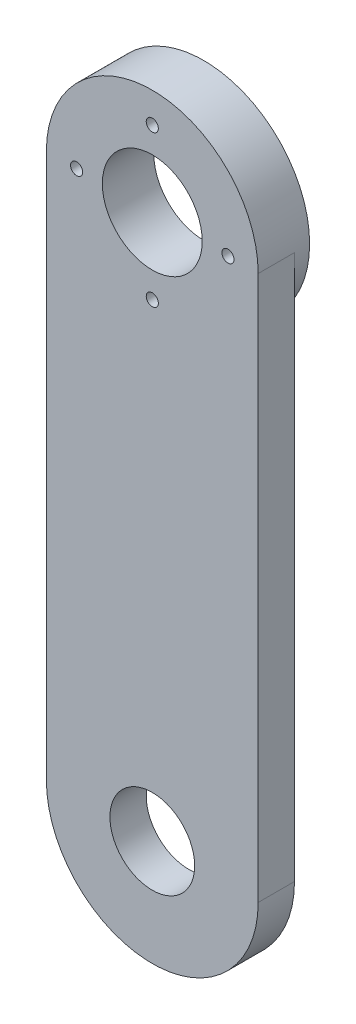
ISO-10303-21;
HEADER;
FILE_DESCRIPTION(('STEP AP214'),'2;1');
FILE_NAME('part.step','',(''),(''),'','','');
FILE_SCHEMA(('AUTOMOTIVE_DESIGN { 1 0 10303 214 1 1 1 1 }'));
ENDSEC;
DATA;
#1=APPLICATION_CONTEXT('core data for automotive mechanical design processes');
#2=APPLICATION_PROTOCOL_DEFINITION('international standard','automotive_design',2000,#1);
#3=PRODUCT_CONTEXT('',#1,'mechanical');
#4=PRODUCT('Part','Part','',(#3));
#5=PRODUCT_RELATED_PRODUCT_CATEGORY('part','',(#4));
#6=PRODUCT_DEFINITION_FORMATION('','',#4);
#7=PRODUCT_DEFINITION_CONTEXT('part definition',#1,'design');
#8=PRODUCT_DEFINITION('design','',#6,#7);
#9=PRODUCT_DEFINITION_SHAPE('','',#8);
#10=(LENGTH_UNIT() NAMED_UNIT(*) SI_UNIT(.MILLI.,.METRE.));
#11=(NAMED_UNIT(*) PLANE_ANGLE_UNIT() SI_UNIT($,.RADIAN.));
#12=(NAMED_UNIT(*) SI_UNIT($,.STERADIAN.) SOLID_ANGLE_UNIT());
#13=UNCERTAINTY_MEASURE_WITH_UNIT(LENGTH_MEASURE(1.E-05),#10,'distance_accuracy_value','');
#14=(GEOMETRIC_REPRESENTATION_CONTEXT(3) GLOBAL_UNCERTAINTY_ASSIGNED_CONTEXT((#13)) GLOBAL_UNIT_ASSIGNED_CONTEXT((#10,
#11,#12)) REPRESENTATION_CONTEXT('',''));
#15=CARTESIAN_POINT('',(0.,0.,0.));
#16=DIRECTION('',(0.,0.,1.));
#17=DIRECTION('',(1.,0.,0.));
#18=AXIS2_PLACEMENT_3D('',#15,#16,#17);
#19=CARTESIAN_POINT('',(0.,53.1386861313869,12.));
#20=DIRECTION('',(0.,0.,1.));
#21=DIRECTION('',(1.,0.,0.));
#22=AXIS2_PLACEMENT_3D('',#19,#20,#21);
#23=PLANE('',#22);
#24=CARTESIAN_POINT('',(0.,28.1386861313869,12.));
#25=DIRECTION('',(0.,0.,1.));
#26=DIRECTION('',(1.,0.,0.));
#27=AXIS2_PLACEMENT_3D('',#24,#25,#26);
#28=CIRCLE('',#27,2.);
#29=CARTESIAN_POINT('',(1.99999999999997,28.1386861313869,12.));
#30=VERTEX_POINT('',#29);
#31=EDGE_CURVE('E148',#30,#30,#28,.T.);
#32=ORIENTED_EDGE('',*,*,#31,.F.);
#33=EDGE_LOOP('',(#32));
#34=FACE_BOUND('',#33,.T.);
#35=CARTESIAN_POINT('',(0.,78.1386861313869,12.));
#36=DIRECTION('',(0.,0.,1.));
#37=DIRECTION('',(1.,0.,0.));
#38=AXIS2_PLACEMENT_3D('',#35,#36,#37);
#39=CIRCLE('',#38,2.);
#40=CARTESIAN_POINT('',(1.99999999999997,78.1386861313869,12.));
#41=VERTEX_POINT('',#40);
#42=EDGE_CURVE('E137',#41,#41,#39,.T.);
#43=ORIENTED_EDGE('',*,*,#42,.F.);
#44=EDGE_LOOP('',(#43));
#45=FACE_BOUND('',#44,.T.);
#46=CARTESIAN_POINT('',(0.,53.1386861313869,12.));
#47=DIRECTION('',(0.,0.,1.));
#48=DIRECTION('',(1.,0.,0.));
#49=AXIS2_PLACEMENT_3D('',#46,#47,#48);
#50=CIRCLE('',#49,16.5);
#51=CARTESIAN_POINT('',(16.5,53.1386861313869,12.));
#52=VERTEX_POINT('',#51);
#53=EDGE_CURVE('E99',#52,#52,#50,.T.);
#54=ORIENTED_EDGE('',*,*,#53,.F.);
#55=EDGE_LOOP('',(#54));
#56=FACE_BOUND('',#55,.T.);
#57=CARTESIAN_POINT('',(0.,53.1386861313869,12.));
#58=DIRECTION('',(0.,0.,1.));
#59=DIRECTION('',(1.,0.,0.));
#60=AXIS2_PLACEMENT_3D('',#57,#58,#59);
#61=CIRCLE('',#60,35.);
#62=CARTESIAN_POINT('',(35.,53.1386861313869,12.));
#63=VERTEX_POINT('',#62);
#64=CARTESIAN_POINT('',(-35.,53.1386861313869,12.));
#65=VERTEX_POINT('',#64);
#66=EDGE_CURVE('E104',#63,#65,#61,.T.);
#67=ORIENTED_EDGE('',*,*,#66,.T.);
#68=DIRECTION('',(0.,-1.,0.));
#69=VECTOR('',#68,1.);
#70=CARTESIAN_POINT('',(-35.,53.1386861313869,12.));
#71=LINE('',#70,#69);
#72=CARTESIAN_POINT('',(-35.,-126.861313868613,12.));
#73=VERTEX_POINT('',#72);
#74=EDGE_CURVE('E87',#65,#73,#71,.T.);
#75=ORIENTED_EDGE('',*,*,#74,.T.);
#76=CARTESIAN_POINT('',(0.,-126.861313868613,12.));
#77=DIRECTION('',(0.,0.,1.));
#78=DIRECTION('',(1.,0.,0.));
#79=AXIS2_PLACEMENT_3D('',#76,#77,#78);
#80=CIRCLE('',#79,35.);
#81=CARTESIAN_POINT('',(35.,-126.861313868613,12.));
#82=VERTEX_POINT('',#81);
#83=EDGE_CURVE('E112',#73,#82,#80,.T.);
#84=ORIENTED_EDGE('',*,*,#83,.T.);
#85=DIRECTION('',(0.,1.,0.));
#86=VECTOR('',#85,1.);
#87=CARTESIAN_POINT('',(35.,53.1386861313869,12.));
#88=LINE('',#87,#86);
#89=EDGE_CURVE('E58',#82,#63,#88,.T.);
#90=ORIENTED_EDGE('',*,*,#89,.T.);
#91=EDGE_LOOP('',(#67,#75,#84,#90));
#92=FACE_BOUND('',#91,.T.);
#93=CARTESIAN_POINT('',(0.,-126.861313868613,12.));
#94=DIRECTION('',(0.,0.,1.));
#95=DIRECTION('',(1.,0.,0.));
#96=AXIS2_PLACEMENT_3D('',#93,#94,#95);
#97=CIRCLE('',#96,14.);
#98=CARTESIAN_POINT('',(14.,-126.861313868613,12.));
#99=VERTEX_POINT('',#98);
#100=EDGE_CURVE('E132',#99,#99,#97,.T.);
#101=ORIENTED_EDGE('',*,*,#100,.F.);
#102=EDGE_LOOP('',(#101));
#103=FACE_BOUND('',#102,.T.);
#104=CARTESIAN_POINT('',(-25.,53.1386861313869,12.));
#105=DIRECTION('',(0.,0.,1.));
#106=DIRECTION('',(1.,0.,0.));
#107=AXIS2_PLACEMENT_3D('',#104,#105,#106);
#108=CIRCLE('',#107,2.);
#109=CARTESIAN_POINT('',(-23.,53.1386861313869,12.));
#110=VERTEX_POINT('',#109);
#111=EDGE_CURVE('E144',#110,#110,#108,.T.);
#112=ORIENTED_EDGE('',*,*,#111,.F.);
#113=EDGE_LOOP('',(#112));
#114=FACE_BOUND('',#113,.T.);
#115=CARTESIAN_POINT('',(25.,53.1386861313869,12.));
#116=DIRECTION('',(0.,0.,1.));
#117=DIRECTION('',(1.,0.,0.));
#118=AXIS2_PLACEMENT_3D('',#115,#116,#117);
#119=CIRCLE('',#118,2.);
#120=CARTESIAN_POINT('',(27.,53.1386861313869,12.));
#121=VERTEX_POINT('',#120);
#122=EDGE_CURVE('E152',#121,#121,#119,.T.);
#123=ORIENTED_EDGE('',*,*,#122,.F.);
#124=EDGE_LOOP('',(#123));
#125=FACE_BOUND('',#124,.T.);
#126=ADVANCED_FACE('F39',(#34,#45,#56,#92,#103,#114,#125),#23,.T.);
#127=CARTESIAN_POINT('',(0.,53.1386861313869,0.));
#128=DIRECTION('',(0.,0.,1.));
#129=DIRECTION('',(1.,0.,0.));
#130=AXIS2_PLACEMENT_3D('',#127,#128,#129);
#131=PLANE('',#130);
#132=CARTESIAN_POINT('',(0.,53.1386861313869,0.));
#133=DIRECTION('',(0.,0.,-1.));
#134=DIRECTION('',(-1.,0.,0.));
#135=AXIS2_PLACEMENT_3D('',#132,#133,#134);
#136=CIRCLE('',#135,35.);
#137=CARTESIAN_POINT('',(35.,53.1386861313869,0.));
#138=VERTEX_POINT('',#137);
#139=CARTESIAN_POINT('',(-35.,53.1386861313869,0.));
#140=VERTEX_POINT('',#139);
#141=EDGE_CURVE('E11',#138,#140,#136,.T.);
#142=ORIENTED_EDGE('',*,*,#141,.F.);
#143=DIRECTION('',(0.,1.,0.));
#144=VECTOR('',#143,1.);
#145=CARTESIAN_POINT('',(35.,53.1386861313869,0.));
#146=LINE('',#145,#144);
#147=CARTESIAN_POINT('',(35.,-126.861313868613,0.));
#148=VERTEX_POINT('',#147);
#149=EDGE_CURVE('E115',#148,#138,#146,.T.);
#150=ORIENTED_EDGE('',*,*,#149,.F.);
#151=CARTESIAN_POINT('',(0.,-126.861313868613,0.));
#152=DIRECTION('',(0.,0.,1.));
#153=DIRECTION('',(1.,0.,0.));
#154=AXIS2_PLACEMENT_3D('',#151,#152,#153);
#155=CIRCLE('',#154,35.);
#156=CARTESIAN_POINT('',(-35.,-126.861313868613,0.));
#157=VERTEX_POINT('',#156);
#158=EDGE_CURVE('E73',#157,#148,#155,.T.);
#159=ORIENTED_EDGE('',*,*,#158,.F.);
#160=DIRECTION('',(0.,-1.,0.));
#161=VECTOR('',#160,1.);
#162=CARTESIAN_POINT('',(-35.,53.1386861313869,0.));
#163=LINE('',#162,#161);
#164=EDGE_CURVE('E91',#140,#157,#163,.T.);
#165=ORIENTED_EDGE('',*,*,#164,.F.);
#166=EDGE_LOOP('',(#142,#150,#159,#165));
#167=FACE_BOUND('',#166,.T.);
#168=CARTESIAN_POINT('',(0.,-126.861313868613,0.));
#169=DIRECTION('',(0.,0.,1.));
#170=DIRECTION('',(1.,0.,0.));
#171=AXIS2_PLACEMENT_3D('',#168,#169,#170);
#172=CIRCLE('',#171,14.);
#173=CARTESIAN_POINT('',(14.,-126.861313868613,0.));
#174=VERTEX_POINT('',#173);
#175=EDGE_CURVE('E133',#174,#174,#172,.T.);
#176=ORIENTED_EDGE('',*,*,#175,.T.);
#177=EDGE_LOOP('',(#176));
#178=FACE_BOUND('',#177,.T.);
#179=ADVANCED_FACE('F96',(#167,#178),#131,.F.);
#180=CARTESIAN_POINT('',(0.,53.1386861313869,12.));
#181=DIRECTION('',(0.,0.,-1.));
#182=DIRECTION('',(-1.,0.,0.));
#183=AXIS2_PLACEMENT_3D('',#180,#181,#182);
#184=CYLINDRICAL_SURFACE('',#183,35.);
#185=DIRECTION('',(0.,0.,-1.));
#186=VECTOR('',#185,1.);
#187=CARTESIAN_POINT('',(35.,53.1386861313869,12.));
#188=LINE('',#187,#186);
#189=EDGE_CURVE('E103',#63,#138,#188,.T.);
#190=ORIENTED_EDGE('',*,*,#189,.T.);
#191=ORIENTED_EDGE('',*,*,#141,.T.);
#192=DIRECTION('',(0.,0.,-1.));
#193=VECTOR('',#192,1.);
#194=CARTESIAN_POINT('',(-35.,53.1386861313869,12.));
#195=LINE('',#194,#193);
#196=EDGE_CURVE('E43',#65,#140,#195,.T.);
#197=ORIENTED_EDGE('',*,*,#196,.F.);
#198=ORIENTED_EDGE('',*,*,#66,.F.);
#199=EDGE_LOOP('',(#190,#191,#197,#198));
#200=FACE_BOUND('',#199,.T.);
#201=CARTESIAN_POINT('',(0.,53.1386861313869,-5.));
#202=DIRECTION('',(0.,0.,-1.));
#203=DIRECTION('',(-1.,0.,0.));
#204=AXIS2_PLACEMENT_3D('',#201,#202,#203);
#205=CIRCLE('',#204,35.);
#206=CARTESIAN_POINT('',(-35.,53.1386861313869,-5.));
#207=VERTEX_POINT('',#206);
#208=EDGE_CURVE('E155',#207,#207,#205,.T.);
#209=ORIENTED_EDGE('',*,*,#208,.F.);
#210=EDGE_LOOP('',(#209));
#211=FACE_BOUND('',#210,.T.);
#212=ADVANCED_FACE('F41',(#200,#211),#184,.T.);
#213=CARTESIAN_POINT('',(-35.,53.1386861313869,12.));
#214=DIRECTION('',(1.,0.,0.));
#215=DIRECTION('',(0.,1.,0.));
#216=AXIS2_PLACEMENT_3D('',#213,#214,#215);
#217=PLANE('',#216);
#218=ORIENTED_EDGE('',*,*,#164,.T.);
#219=DIRECTION('',(0.,0.,-1.));
#220=VECTOR('',#219,1.);
#221=CARTESIAN_POINT('',(-35.,-126.861313868613,12.));
#222=LINE('',#221,#220);
#223=EDGE_CURVE('E95',#73,#157,#222,.T.);
#224=ORIENTED_EDGE('',*,*,#223,.F.);
#225=ORIENTED_EDGE('',*,*,#74,.F.);
#226=ORIENTED_EDGE('',*,*,#196,.T.);
#227=EDGE_LOOP('',(#218,#224,#225,#226));
#228=FACE_BOUND('',#227,.T.);
#229=ADVANCED_FACE('F90',(#228),#217,.F.);
#230=CARTESIAN_POINT('',(0.,-126.861313868613,12.));
#231=DIRECTION('',(0.,0.,-1.));
#232=DIRECTION('',(-1.,0.,0.));
#233=AXIS2_PLACEMENT_3D('',#230,#231,#232);
#234=CYLINDRICAL_SURFACE('',#233,35.);
#235=ORIENTED_EDGE('',*,*,#158,.T.);
#236=DIRECTION('',(0.,0.,-1.));
#237=VECTOR('',#236,1.);
#238=CARTESIAN_POINT('',(35.,-126.861313868613,12.));
#239=LINE('',#238,#237);
#240=EDGE_CURVE('E107',#82,#148,#239,.T.);
#241=ORIENTED_EDGE('',*,*,#240,.F.);
#242=ORIENTED_EDGE('',*,*,#83,.F.);
#243=ORIENTED_EDGE('',*,*,#223,.T.);
#244=EDGE_LOOP('',(#235,#241,#242,#243));
#245=FACE_BOUND('',#244,.T.);
#246=ADVANCED_FACE('F119',(#245),#234,.T.);
#247=CARTESIAN_POINT('',(35.,53.1386861313869,12.));
#248=DIRECTION('',(-1.,0.,0.));
#249=DIRECTION('',(0.,0.,1.));
#250=AXIS2_PLACEMENT_3D('',#247,#248,#249);
#251=PLANE('',#250);
#252=ORIENTED_EDGE('',*,*,#149,.T.);
#253=ORIENTED_EDGE('',*,*,#189,.F.);
#254=ORIENTED_EDGE('',*,*,#89,.F.);
#255=ORIENTED_EDGE('',*,*,#240,.T.);
#256=EDGE_LOOP('',(#252,#253,#254,#255));
#257=FACE_BOUND('',#256,.T.);
#258=ADVANCED_FACE('F213',(#257),#251,.F.);
#259=CARTESIAN_POINT('',(0.,53.1386861313869,12.));
#260=DIRECTION('',(0.,0.,-1.));
#261=DIRECTION('',(-1.,0.,0.));
#262=AXIS2_PLACEMENT_3D('',#259,#260,#261);
#263=CYLINDRICAL_SURFACE('',#262,16.5);
#264=ORIENTED_EDGE('',*,*,#53,.T.);
#265=EDGE_LOOP('',(#264));
#266=FACE_BOUND('',#265,.T.);
#267=CARTESIAN_POINT('',(0.,53.1386861313869,-5.));
#268=DIRECTION('',(0.,0.,-1.));
#269=DIRECTION('',(-1.,0.,0.));
#270=AXIS2_PLACEMENT_3D('',#267,#268,#269);
#271=CIRCLE('',#270,16.5);
#272=CARTESIAN_POINT('',(-16.5,53.1386861313869,-5.));
#273=VERTEX_POINT('',#272);
#274=EDGE_CURVE('E160',#273,#273,#271,.F.);
#275=ORIENTED_EDGE('',*,*,#274,.F.);
#276=EDGE_LOOP('',(#275));
#277=FACE_BOUND('',#276,.T.);
#278=ADVANCED_FACE('F210',(#266,#277),#263,.F.);
#279=CARTESIAN_POINT('',(0.,-126.861313868613,12.));
#280=DIRECTION('',(0.,0.,-1.));
#281=DIRECTION('',(-1.,0.,0.));
#282=AXIS2_PLACEMENT_3D('',#279,#280,#281);
#283=CYLINDRICAL_SURFACE('',#282,14.);
#284=ORIENTED_EDGE('',*,*,#100,.T.);
#285=EDGE_LOOP('',(#284));
#286=FACE_BOUND('',#285,.T.);
#287=ORIENTED_EDGE('',*,*,#175,.F.);
#288=EDGE_LOOP('',(#287));
#289=FACE_BOUND('',#288,.T.);
#290=ADVANCED_FACE('F197',(#286,#289),#283,.F.);
#291=CARTESIAN_POINT('',(0.,78.1386861313869,12.));
#292=DIRECTION('',(0.,0.,-1.));
#293=DIRECTION('',(-1.,0.,0.));
#294=AXIS2_PLACEMENT_3D('',#291,#292,#293);
#295=CYLINDRICAL_SURFACE('',#294,2.);
#296=ORIENTED_EDGE('',*,*,#42,.T.);
#297=EDGE_LOOP('',(#296));
#298=FACE_BOUND('',#297,.T.);
#299=CARTESIAN_POINT('',(0.,78.1386861313869,-5.));
#300=DIRECTION('',(0.,0.,-1.));
#301=DIRECTION('',(-1.,0.,0.));
#302=AXIS2_PLACEMENT_3D('',#299,#300,#301);
#303=CIRCLE('',#302,2.);
#304=CARTESIAN_POINT('',(-2.00000000000003,78.1386861313869,-5.));
#305=VERTEX_POINT('',#304);
#306=EDGE_CURVE('E164',#305,#305,#303,.F.);
#307=ORIENTED_EDGE('',*,*,#306,.F.);
#308=EDGE_LOOP('',(#307));
#309=FACE_BOUND('',#308,.T.);
#310=ADVANCED_FACE('F187',(#298,#309),#295,.F.);
#311=CARTESIAN_POINT('',(-25.,53.1386861313869,12.));
#312=DIRECTION('',(0.,0.,-1.));
#313=DIRECTION('',(-1.,0.,0.));
#314=AXIS2_PLACEMENT_3D('',#311,#312,#313);
#315=CYLINDRICAL_SURFACE('',#314,2.);
#316=ORIENTED_EDGE('',*,*,#111,.T.);
#317=EDGE_LOOP('',(#316));
#318=FACE_BOUND('',#317,.T.);
#319=CARTESIAN_POINT('',(-25.,53.1386861313869,-5.));
#320=DIRECTION('',(0.,0.,-1.));
#321=DIRECTION('',(-1.,0.,0.));
#322=AXIS2_PLACEMENT_3D('',#319,#320,#321);
#323=CIRCLE('',#322,2.);
#324=CARTESIAN_POINT('',(-27.,53.1386861313869,-5.));
#325=VERTEX_POINT('',#324);
#326=EDGE_CURVE('E176',#325,#325,#323,.F.);
#327=ORIENTED_EDGE('',*,*,#326,.F.);
#328=EDGE_LOOP('',(#327));
#329=FACE_BOUND('',#328,.T.);
#330=ADVANCED_FACE('F184',(#318,#329),#315,.F.);
#331=CARTESIAN_POINT('',(0.,28.1386861313869,12.));
#332=DIRECTION('',(0.,0.,-1.));
#333=DIRECTION('',(-1.,0.,0.));
#334=AXIS2_PLACEMENT_3D('',#331,#332,#333);
#335=CYLINDRICAL_SURFACE('',#334,2.);
#336=ORIENTED_EDGE('',*,*,#31,.T.);
#337=EDGE_LOOP('',(#336));
#338=FACE_BOUND('',#337,.T.);
#339=CARTESIAN_POINT('',(0.,28.1386861313869,-5.));
#340=DIRECTION('',(0.,0.,-1.));
#341=DIRECTION('',(-1.,0.,0.));
#342=AXIS2_PLACEMENT_3D('',#339,#340,#341);
#343=CIRCLE('',#342,2.);
#344=CARTESIAN_POINT('',(-2.00000000000003,28.1386861313869,-5.));
#345=VERTEX_POINT('',#344);
#346=EDGE_CURVE('E168',#345,#345,#343,.F.);
#347=ORIENTED_EDGE('',*,*,#346,.F.);
#348=EDGE_LOOP('',(#347));
#349=FACE_BOUND('',#348,.T.);
#350=ADVANCED_FACE('F186',(#338,#349),#335,.F.);
#351=CARTESIAN_POINT('',(25.,53.1386861313869,12.));
#352=DIRECTION('',(0.,0.,-1.));
#353=DIRECTION('',(-1.,0.,0.));
#354=AXIS2_PLACEMENT_3D('',#351,#352,#353);
#355=CYLINDRICAL_SURFACE('',#354,2.);
#356=ORIENTED_EDGE('',*,*,#122,.T.);
#357=EDGE_LOOP('',(#356));
#358=FACE_BOUND('',#357,.T.);
#359=CARTESIAN_POINT('',(25.,53.1386861313869,-5.));
#360=DIRECTION('',(0.,0.,-1.));
#361=DIRECTION('',(-1.,0.,0.));
#362=AXIS2_PLACEMENT_3D('',#359,#360,#361);
#363=CIRCLE('',#362,2.);
#364=CARTESIAN_POINT('',(23.,53.1386861313869,-5.));
#365=VERTEX_POINT('',#364);
#366=EDGE_CURVE('E172',#365,#365,#363,.F.);
#367=ORIENTED_EDGE('',*,*,#366,.F.);
#368=EDGE_LOOP('',(#367));
#369=FACE_BOUND('',#368,.T.);
#370=ADVANCED_FACE('F194',(#358,#369),#355,.F.);
#371=CARTESIAN_POINT('',(0.,0.,-5.));
#372=DIRECTION('',(0.,0.,-1.));
#373=DIRECTION('',(-1.,0.,0.));
#374=AXIS2_PLACEMENT_3D('',#371,#372,#373);
#375=PLANE('',#374);
#376=ORIENTED_EDGE('',*,*,#326,.T.);
#377=EDGE_LOOP('',(#376));
#378=FACE_BOUND('',#377,.T.);
#379=ORIENTED_EDGE('',*,*,#366,.T.);
#380=EDGE_LOOP('',(#379));
#381=FACE_BOUND('',#380,.T.);
#382=ORIENTED_EDGE('',*,*,#346,.T.);
#383=EDGE_LOOP('',(#382));
#384=FACE_BOUND('',#383,.T.);
#385=ORIENTED_EDGE('',*,*,#306,.T.);
#386=EDGE_LOOP('',(#385));
#387=FACE_BOUND('',#386,.T.);
#388=ORIENTED_EDGE('',*,*,#274,.T.);
#389=EDGE_LOOP('',(#388));
#390=FACE_BOUND('',#389,.T.);
#391=ORIENTED_EDGE('',*,*,#208,.T.);
#392=EDGE_LOOP('',(#391));
#393=FACE_BOUND('',#392,.T.);
#394=ADVANCED_FACE('F181',(#378,#381,#384,#387,#390,#393),#375,.T.);
#395=CLOSED_SHELL('',(#126,#179,#212,#229,#246,#258,#278,#290,#310,#330,#350,#370,#394));
#396=MANIFOLD_SOLID_BREP('B2',#395);
#397=ADVANCED_BREP_SHAPE_REPRESENTATION('',(#18,#396),#14);
#398=SHAPE_DEFINITION_REPRESENTATION(#9,#397);
ENDSEC;
END-ISO-10303-21;
